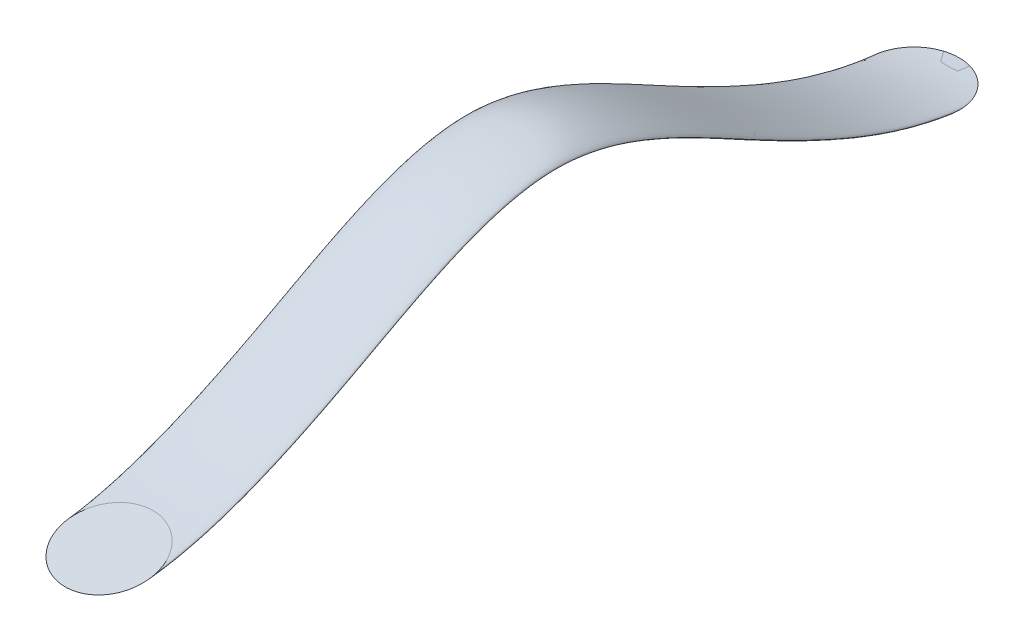
ISO-10303-21;
HEADER;
FILE_DESCRIPTION(('STEP AP214'),'2;1');
FILE_NAME('part.step','',(''),(''),'','','');
FILE_SCHEMA(('AUTOMOTIVE_DESIGN { 1 0 10303 214 1 1 1 1 }'));
ENDSEC;
DATA;
#1=APPLICATION_CONTEXT('core data for automotive mechanical design processes');
#2=APPLICATION_PROTOCOL_DEFINITION('international standard','automotive_design',2000,#1);
#3=PRODUCT_CONTEXT('',#1,'mechanical');
#4=PRODUCT('Part','Part','',(#3));
#5=PRODUCT_RELATED_PRODUCT_CATEGORY('part','',(#4));
#6=PRODUCT_DEFINITION_FORMATION('','',#4);
#7=PRODUCT_DEFINITION_CONTEXT('part definition',#1,'design');
#8=PRODUCT_DEFINITION('design','',#6,#7);
#9=PRODUCT_DEFINITION_SHAPE('','',#8);
#10=(LENGTH_UNIT() NAMED_UNIT(*) SI_UNIT(.MILLI.,.METRE.));
#11=(NAMED_UNIT(*) PLANE_ANGLE_UNIT() SI_UNIT($,.RADIAN.));
#12=(NAMED_UNIT(*) SI_UNIT($,.STERADIAN.) SOLID_ANGLE_UNIT());
#13=UNCERTAINTY_MEASURE_WITH_UNIT(LENGTH_MEASURE(1.E-05),#10,'distance_accuracy_value','');
#14=(GEOMETRIC_REPRESENTATION_CONTEXT(3) GLOBAL_UNCERTAINTY_ASSIGNED_CONTEXT((#13)) GLOBAL_UNIT_ASSIGNED_CONTEXT((#10,
#11,#12)) REPRESENTATION_CONTEXT('',''));
#15=CARTESIAN_POINT('',(0.,0.,0.));
#16=DIRECTION('',(0.,0.,1.));
#17=DIRECTION('',(1.,0.,0.));
#18=AXIS2_PLACEMENT_3D('',#15,#16,#17);
#19=CARTESIAN_POINT('',(0.002851618227563,0.,320.));
#20=DIRECTION('',(0.,-0.969230769230747,-0.246153846153936));
#21=DIRECTION('',(0.,0.246153846153936,-0.969230769230747));
#22=AXIS2_PLACEMENT_3D('',#19,#20,#21);
#23=PLANE('',#22);
#24=CARTESIAN_POINT('',(18.,0.,320.));
#25=CARTESIAN_POINT('',(18.,-7.361913934838,348.98753611842));
#26=CARTESIAN_POINT('',(-18.98186742986,-8.418959482688,353.14965296308));
#27=CARTESIAN_POINT('',(-49.48410457815,0.,320.));
#28=CARTESIAN_POINT('',(-18.98186742986,8.418959482688,286.85034703691));
#29=CARTESIAN_POINT('',(18.,7.361913934838,291.01246388157));
#30=CARTESIAN_POINT('',(18.,0.,320.));
#31=(BOUNDED_CURVE() B_SPLINE_CURVE(6,(#24,#25,#26,#27,#28,#29,#30),.UNSPECIFIED.,.T.,
.F.) B_SPLINE_CURVE_WITH_KNOTS((7,7),(0.,6.28318530718),
.UNSPECIFIED.) CURVE() GEOMETRIC_REPRESENTATION_ITEM() RATIONAL_B_SPLINE_CURVE((1.669078461068,
1.03672962321,1.038346699848,0.853534330196,1.038346699848,1.03672962321,1.669078461068)) REPRESENTATION_ITEM(''));
#32=CARTESIAN_POINT('',(18.,0.,320.));
#33=VERTEX_POINT('',#32);
#34=EDGE_CURVE('E10',#33,#33,#31,.T.);
#35=ORIENTED_EDGE('',*,*,#34,.F.);
#36=EDGE_LOOP('',(#35));
#37=FACE_BOUND('',#36,.T.);
#38=ADVANCED_FACE('F16',(#37),#23,.F.);
#39=CARTESIAN_POINT('',(0.002851618227622,0.,0.));
#40=DIRECTION('',(0.,-1.,0.));
#41=DIRECTION('',(0.,0.,-1.));
#42=AXIS2_PLACEMENT_3D('',#39,#40,#41);
#43=PLANE('',#42);
#44=CARTESIAN_POINT('',(18.,0.,0.));
#45=CARTESIAN_POINT('',(18.,0.,29.907775360279));
#46=CARTESIAN_POINT('',(-18.98186742986,0.,34.202022898421));
#47=CARTESIAN_POINT('',(-49.48410457815,0.,0.));
#48=CARTESIAN_POINT('',(-18.98186742986,0.,-34.20202289842));
#49=CARTESIAN_POINT('',(18.,0.,-29.90777536027));
#50=CARTESIAN_POINT('',(18.,0.,0.));
#51=(BOUNDED_CURVE() B_SPLINE_CURVE(6,(#44,#45,#46,#47,#48,#49,#50),.UNSPECIFIED.,.T.,
.F.) B_SPLINE_CURVE_WITH_KNOTS((7,7),(0.,6.28318530718),
.UNSPECIFIED.) CURVE() GEOMETRIC_REPRESENTATION_ITEM() RATIONAL_B_SPLINE_CURVE((1.669078461068,
1.03672962321,1.038346699848,0.853534330196,1.038346699848,1.03672962321,1.669078461068)) REPRESENTATION_ITEM(''));
#52=CARTESIAN_POINT('',(18.,0.,0.));
#53=VERTEX_POINT('',#52);
#54=EDGE_CURVE('E42',#53,#53,#51,.T.);
#55=ORIENTED_EDGE('',*,*,#54,.T.);
#56=EDGE_LOOP('',(#55));
#57=FACE_BOUND('',#56,.T.);
#58=ADVANCED_FACE('F45',(#57),#43,.T.);
#59=CARTESIAN_POINT('',(18.,0.,0.));
#60=CARTESIAN_POINT('',(18.,1.,7.999999999997));
#61=CARTESIAN_POINT('',(17.999999999999,2.611111111111,16.000000000014));
#62=CARTESIAN_POINT('',(18.000000000001,4.770833333332,23.999999999966));
#63=CARTESIAN_POINT('',(17.999999999998,7.41666666667,32.000000000059));
#64=CARTESIAN_POINT('',(18.000000000003,10.486111111105,39.99999999993));
#65=CARTESIAN_POINT('',(17.999999999997,13.916666666673,48.000000000061));
#66=CARTESIAN_POINT('',(18.000000000002,17.645833333329,55.999999999962));
#67=CARTESIAN_POINT('',(17.999999999999,21.611111111113,64.0000000000159));
#68=CARTESIAN_POINT('',(18.,25.75,71.999999999997));
#69=CARTESIAN_POINT('',(18.,34.25,88.000000000002));
#70=CARTESIAN_POINT('',(17.999999999999,38.611111111109,95.9999999999979));
#71=CARTESIAN_POINT('',(18.000000000003,42.937500000004,104.));
#72=CARTESIAN_POINT('',(17.999999999995,47.083333333328,111.99999999999));
#73=CARTESIAN_POINT('',(18.000000000005,50.902777777784,120.));
#74=CARTESIAN_POINT('',(17.999999999996,54.249999999995,127.99999999999));
#75=CARTESIAN_POINT('',(18.000000000002,56.979166666669,136.));
#76=CARTESIAN_POINT('',(18.,58.944444444444,143.99999999999));
#77=CARTESIAN_POINT('',(18.,60.,152.));
#78=CARTESIAN_POINT('',(18.,60.,167.99999999999));
#79=CARTESIAN_POINT('',(17.999999999999,58.944444444442,176.));
#80=CARTESIAN_POINT('',(18.000000000003,56.979166666672,183.99999999999));
#81=CARTESIAN_POINT('',(17.999999999994,54.249999999992,192.));
#82=CARTESIAN_POINT('',(18.000000000007,50.902777777785,199.99999999999));
#83=CARTESIAN_POINT('',(17.999999999994,47.083333333329,208.));
#84=CARTESIAN_POINT('',(18.000000000003,42.937500000002,215.99999999999));
#85=CARTESIAN_POINT('',(17.999999999999,38.61111111111,224.));
#86=CARTESIAN_POINT('',(18.,34.25,231.99999999999));
#87=CARTESIAN_POINT('',(18.,25.75,248.));
#88=CARTESIAN_POINT('',(17.999999999999,21.611111111113,255.99999999999));
#89=CARTESIAN_POINT('',(18.000000000003,17.645833333331,264.00000000001));
#90=CARTESIAN_POINT('',(17.999999999995,13.91666666667,271.99999999997));
#91=CARTESIAN_POINT('',(18.000000000006,10.486111111108,280.00000000002));
#92=CARTESIAN_POINT('',(17.999999999995,7.41666666666899,287.99999999998));
#93=CARTESIAN_POINT('',(18.000000000003,4.770833333332,296.00000000001));
#94=CARTESIAN_POINT('',(17.999999999998,2.611111111112,303.99999999999));
#95=CARTESIAN_POINT('',(18.,1.,312.));
#96=CARTESIAN_POINT('',(18.,0.,320.));
#97=CARTESIAN_POINT('',(18.,0.,29.907775360279));
#98=CARTESIAN_POINT('',(18.,3.024526332081,37.90777536028));
#99=CARTESIAN_POINT('',(17.999999999999,6.438047910399,45.755503294274));
#100=CARTESIAN_POINT('',(18.000000000001,10.152053909414,53.5073571757081));
#101=CARTESIAN_POINT('',(17.999999999999,14.109930858211,61.218031004849));
#102=CARTESIAN_POINT('',(18.000000000001,18.271009251131,68.9247641940741));
#103=CARTESIAN_POINT('',(17.999999999999,22.597387757939,76.64978772286));
#104=CARTESIAN_POINT('',(18.,27.046976310694,84.407085050043));
#105=CARTESIAN_POINT('',(18.,31.572729087688,92.206178395924));
#106=CARTESIAN_POINT('',(18.,36.124568157119,100.05224358835));
#107=CARTESIAN_POINT('',(18.,45.169488416741,115.84465491802));
#108=CARTESIAN_POINT('',(18.,49.480929520386,123.86019727869));
#109=CARTESIAN_POINT('',(18.,53.452628086978,132.0026944003));
#110=CARTESIAN_POINT('',(18.,56.927628678932,140.26340634723));
#111=CARTESIAN_POINT('',(17.999999999999,59.737290538436,148.64600520067));
#112=CARTESIAN_POINT('',(18.000000000001,61.649720994024,157.09693076155));
#113=CARTESIAN_POINT('',(17.999999999999,62.486851956086,165.60688757064));
#114=CARTESIAN_POINT('',(18.,61.908423664922,174.03876773349));
#115=CARTESIAN_POINT('',(18.,59.814519851051,182.11733918548));
#116=CARTESIAN_POINT('',(18.,52.766274191017,197.23630847797));
#117=CARTESIAN_POINT('',(17.999999999998,48.677506373275,204.38490307204));
#118=CARTESIAN_POINT('',(18.000000000004,44.353099368763,211.34016849721));
#119=CARTESIAN_POINT('',(17.999999999993,39.915641310642,218.38017080115));
#120=CARTESIAN_POINT('',(18.000000000008,35.288771821893,225.58994036109));
#121=CARTESIAN_POINT('',(17.999999999993,30.584793205205,232.97055191303));
#122=CARTESIAN_POINT('',(18.000000000004,25.852943386392,240.55273381272));
#123=CARTESIAN_POINT('',(17.999999999998,21.217853938134,248.32731283091));
#124=CARTESIAN_POINT('',(18.,16.812426939338,256.30002223335));
#125=CARTESIAN_POINT('',(18.,8.789481672119,272.63535777773));
#126=CARTESIAN_POINT('',(18.000000000001,5.012945159436,280.88620540488));
#127=CARTESIAN_POINT('',(17.999999999998,1.541443050643,289.21889339254));
#128=CARTESIAN_POINT('',(18.000000000003,-1.549210753571,297.63146290892));
#129=CARTESIAN_POINT('',(17.999999999996,-4.179193656993,306.11848883054));
#130=CARTESIAN_POINT('',(18.000000000003,-6.262781643254,314.67144194218));
#131=CARTESIAN_POINT('',(17.999999999998,-7.708160683656,323.27483035155));
#132=CARTESIAN_POINT('',(18.,-8.422505366791,331.89793413463));
#133=CARTESIAN_POINT('',(18.,-8.324147149008,340.48919117514));
#134=CARTESIAN_POINT('',(18.,-7.361913934838,348.98753611842));
#135=CARTESIAN_POINT('',(-18.98186742986,0.,34.202022898421));
#136=CARTESIAN_POINT('',(-18.98186742986,3.31521385774,42.202022898422));
#137=CARTESIAN_POINT('',(-18.98186742986,6.987530903735,50.027887155271));
#138=CARTESIAN_POINT('',(-18.98186742986,10.924705600576,57.744111477308));
#139=CARTESIAN_POINT('',(-18.98186742986,15.070969682747,65.413242992376));
#140=CARTESIAN_POINT('',(-18.98186742986,19.388788132032,73.077868058731));
#141=CARTESIAN_POINT('',(-18.98186742986,23.843791568536,80.763409646081));
#142=CARTESIAN_POINT('',(-18.98186742986,28.396820443195,88.485859000051));
#143=CARTESIAN_POINT('',(-18.98186742986,33.003047891294,96.256105569639));
#144=CARTESIAN_POINT('',(-18.98186742986,37.614179578608,104.08006834354));
#145=CARTESIAN_POINT('',(-18.98186742986,46.737341113456,119.84267347312));
#146=CARTESIAN_POINT('',(-18.98186742986,51.041650449367,127.86044745227));
#147=CARTESIAN_POINT('',(-18.98186742986,54.962421522194,136.02340473536));
#148=CARTESIAN_POINT('',(-18.98186742986,58.3411019494489,144.32155048079));
#149=CARTESIAN_POINT('',(-18.98186742986,61.005776215368,152.75908401809));
#150=CARTESIAN_POINT('',(-18.98186742986,62.712194992123,161.27475481517));
#151=CARTESIAN_POINT('',(-18.98186742986,63.277661827773,169.85793274303));
#152=CARTESIAN_POINT('',(-18.98186742986,62.3340006367049,178.35182354705));
#153=CARTESIAN_POINT('',(-18.98186742986,59.787888058369,186.44167652233));
#154=CARTESIAN_POINT('',(-18.98186742986,51.727634276392,201.43414479958));
#155=CARTESIAN_POINT('',(-18.98186742986,47.20334880036,208.46049206751));
#156=CARTESIAN_POINT('',(-18.98186742986,42.54021098916,215.2657513882));
#157=CARTESIAN_POINT('',(-18.98186742986,37.857471360818,222.16791436125));
#158=CARTESIAN_POINT('',(-18.98186742987,33.046866303047,229.26422027906));
#159=CARTESIAN_POINT('',(-18.98186742986,28.215883633209,236.55589819125));
#160=CARTESIAN_POINT('',(-18.98186742986,23.399891820554,244.07808852266));
#161=CARTESIAN_POINT('',(-18.98186742986,18.720478225781,251.82030092432));
#162=CARTESIAN_POINT('',(-18.98186742986,14.308688219728,259.78909186141));
#163=CARTESIAN_POINT('',(-18.98186742986,6.354239893092,276.17257588285));
#164=CARTESIAN_POINT('',(-18.98186742986,2.629731014718,284.45944096006));
#165=CARTESIAN_POINT('',(-18.98186742986,-0.770873311627,292.83989728071));
#166=CARTESIAN_POINT('',(-18.98186742987,-3.769847535713,301.31170475803));
#167=CARTESIAN_POINT('',(-18.98186742986,-6.284881831318,309.86865931333));
#168=CARTESIAN_POINT('',(-18.98186742987,-8.226917608581,318.50100708094));
#169=CARTESIAN_POINT('',(-18.98186742986,-9.499931843175,327.19103179684));
#170=CARTESIAN_POINT('',(-18.98186742986,-10.00674491073,335.90360267846));
#171=CARTESIAN_POINT('',(-18.98186742986,-9.662935990959,344.57975416733));
#172=CARTESIAN_POINT('',(-18.98186742986,-8.418959482688,353.14965296308));
#173=CARTESIAN_POINT('',(-49.48410457815,0.,0.));
#174=CARTESIAN_POINT('',(-49.48410457815,1.000000000001,8.000000000002));
#175=CARTESIAN_POINT('',(-49.48410457815,2.611111111109,15.999999999994));
#176=CARTESIAN_POINT('',(-49.48410457814,4.770833333337,24.000000000011));
#177=CARTESIAN_POINT('',(-49.48410457816,7.416666666663,31.999999999989));
#178=CARTESIAN_POINT('',(-49.48410457813,10.486111111113,40.000000000007));
#179=CARTESIAN_POINT('',(-49.48410457817,13.916666666667,47.999999999999));
#180=CARTESIAN_POINT('',(-49.48410457814,17.645833333332,55.999999999998));
#181=CARTESIAN_POINT('',(-49.48410457815,21.611111111112,64.000000000002));
#182=CARTESIAN_POINT('',(-49.48410457815,25.75,71.9999999999991));
#183=CARTESIAN_POINT('',(-49.48410457815,34.25,88.0000000000009));
#184=CARTESIAN_POINT('',(-49.48410457815,38.61111111111,95.9999999999971));
#185=CARTESIAN_POINT('',(-49.48410457815,42.937500000002,104.));
#186=CARTESIAN_POINT('',(-49.48410457814,47.083333333331,111.99999999999));
#187=CARTESIAN_POINT('',(-49.48410457816,50.902777777779,120.));
#188=CARTESIAN_POINT('',(-49.48410457814,54.25,127.99999999999));
#189=CARTESIAN_POINT('',(-49.48410457815,56.979166666666,136.));
#190=CARTESIAN_POINT('',(-49.48410457815,58.944444444445,143.99999999999));
#191=CARTESIAN_POINT('',(-49.48410457815,60.,152.));
#192=CARTESIAN_POINT('',(-49.48410457815,60.,168.));
#193=CARTESIAN_POINT('',(-49.48410457815,58.944444444445,175.99999999999));
#194=CARTESIAN_POINT('',(-49.48410457815,56.979166666665,184.));
#195=CARTESIAN_POINT('',(-49.48410457814,54.250000000004,191.99999999998));
#196=CARTESIAN_POINT('',(-49.48410457816,50.902777777772,200.00000000001));
#197=CARTESIAN_POINT('',(-49.48410457814,47.08333333334,207.99999999998));
#198=CARTESIAN_POINT('',(-49.48410457815,42.937499999995,216.00000000001));
#199=CARTESIAN_POINT('',(-49.48410457815,38.611111111113,223.99999999999));
#200=CARTESIAN_POINT('',(-49.48410457815,34.25,232.));
#201=CARTESIAN_POINT('',(-49.48410457815,25.75,248.));
#202=CARTESIAN_POINT('',(-49.48410457815,21.611111111111,255.99999999999));
#203=CARTESIAN_POINT('',(-49.48410457815,17.645833333335,264.00000000001));
#204=CARTESIAN_POINT('',(-49.48410457815,13.916666666663,271.99999999998));
#205=CARTESIAN_POINT('',(-49.48410457815,10.486111111116,280.00000000001));
#206=CARTESIAN_POINT('',(-49.48410457815,7.416666666661,287.99999999999));
#207=CARTESIAN_POINT('',(-49.48410457815,4.770833333337,296.));
#208=CARTESIAN_POINT('',(-49.48410457815,2.611111111109,304.));
#209=CARTESIAN_POINT('',(-49.48410457815,1.,312.));
#210=CARTESIAN_POINT('',(-49.48410457815,0.,320.));
#211=CARTESIAN_POINT('',(-18.98186742986,0.,-34.20202289842));
#212=CARTESIAN_POINT('',(-18.98186742986,-1.315213857739,-26.20202289842));
#213=CARTESIAN_POINT('',(-18.98186742986,-1.765308681513,-18.02788715527));
#214=CARTESIAN_POINT('',(-18.98186742986,-1.38303893391,-9.74411147730499));
#215=CARTESIAN_POINT('',(-18.98186742986,-0.237636349409,-1.413242992374));
#216=CARTESIAN_POINT('',(-18.98186742987,1.583434090181,6.922131941262));
#217=CARTESIAN_POINT('',(-18.98186742986,3.989541764808,15.236590353927));
#218=CARTESIAN_POINT('',(-18.98186742986,6.894846223463,23.514140999943));
#219=CARTESIAN_POINT('',(-18.98186742986,10.219174330933,31.743894430364));
#220=CARTESIAN_POINT('',(-18.98186742986,13.885820421391,39.919931656457));
#221=CARTESIAN_POINT('',(-18.98186742986,21.762658886545,56.157326526875));
#222=CARTESIAN_POINT('',(-18.98186742986,26.180571772853,64.139552547727));
#223=CARTESIAN_POINT('',(-18.98186742986,30.912578477811,71.976595264634));
#224=CARTESIAN_POINT('',(-18.98186742986,35.825564717212,79.67844951921));
#225=CARTESIAN_POINT('',(-18.98186742986,40.799779340193,87.240915981893));
#226=CARTESIAN_POINT('',(-18.98186742986,45.787805007874,94.725245184837));
#227=CARTESIAN_POINT('',(-18.98186742986,50.680671505562,102.14206725696));
#228=CARTESIAN_POINT('',(-18.98186742986,55.554888252183,109.64817645294));
#229=CARTESIAN_POINT('',(-18.98186742986,60.212111941631,117.55832347766));
#230=CARTESIAN_POINT('',(-18.98186742986,68.2723657236089,134.56585520041));
#231=CARTESIAN_POINT('',(-18.98186742986,70.685540088525,143.53950793248));
#232=CARTESIAN_POINT('',(-18.98186742986,71.418122344182,152.73424861179));
#233=CARTESIAN_POINT('',(-18.98186742986,70.642528639171,161.83208563873));
#234=CARTESIAN_POINT('',(-18.98186742987,68.7586892525181,170.73577972095));
#235=CARTESIAN_POINT('',(-18.98186742986,65.950783033453,179.44410180872));
#236=CARTESIAN_POINT('',(-18.98186742986,62.475108179447,187.92191147735));
#237=CARTESIAN_POINT('',(-18.98186742986,58.501743996442,196.17969907566));
#238=CARTESIAN_POINT('',(-18.98186742986,54.191311780272,204.21090813859));
#239=CARTESIAN_POINT('',(-18.98186742986,45.145760106908,219.82742411714));
#240=CARTESIAN_POINT('',(-18.98186742986,40.592491207504,227.54055903993));
#241=CARTESIAN_POINT('',(-18.98186742986,36.062539978294,235.1601027193));
#242=CARTESIAN_POINT('',(-18.98186742987,31.603180869044,242.68829524195));
#243=CARTESIAN_POINT('',(-18.98186742985,27.257104053545,250.13134068668));
#244=CARTESIAN_POINT('',(-18.98186742987,23.060250941909,257.49899291904));
#245=CARTESIAN_POINT('',(-18.98186742986,19.041598509845,264.80896820316));
#246=CARTESIAN_POINT('',(-18.98186742986,15.228967132952,272.09639732153));
#247=CARTESIAN_POINT('',(-18.98186742986,11.662935990959,279.42024583266));
#248=CARTESIAN_POINT('',(-18.98186742986,8.418959482688,286.85034703691));
#249=CARTESIAN_POINT('',(18.,0.,-29.90777536027));
#250=CARTESIAN_POINT('',(18.,-1.02452633208,-21.90777536027));
#251=CARTESIAN_POINT('',(18.000000000001,-1.215825688179,-13.75550329428));
#252=CARTESIAN_POINT('',(17.999999999999,-0.610387242745,-5.507357175698));
#253=CARTESIAN_POINT('',(18.000000000002,0.723402475122,2.781968995146));
#254=CARTESIAN_POINT('',(17.999999999997,2.701212971087,11.075235805922));
#255=CARTESIAN_POINT('',(18.000000000002,5.235945575401,19.35021227715));
#256=CARTESIAN_POINT('',(17.999999999999,8.244690355967,27.592914949947));
#257=CARTESIAN_POINT('',(18.000000000001,11.649493134538,35.793821604081));
#258=CARTESIAN_POINT('',(18.,15.37543184288,43.947756411642));
#259=CARTESIAN_POINT('',(18.,23.33051158326,60.155345081975));
#260=CARTESIAN_POINT('',(18.,27.741292701835,68.139802721298));
#261=CARTESIAN_POINT('',(18.,32.422371913023,75.997305599708));
#262=CARTESIAN_POINT('',(17.999999999999,37.239037987736,83.736593652751));
#263=CARTESIAN_POINT('',(18.000000000001,42.068265017115,91.353994799338));
#264=CARTESIAN_POINT('',(17.999999999999,46.850279005981,98.9030692384329));
#265=CARTESIAN_POINT('',(18.,51.471481377244,106.39311242936));
#266=CARTESIAN_POINT('',(18.,55.980465223968,113.9612322665));
#267=CARTESIAN_POINT('',(18.,60.185480148948,121.88266081452));
#268=CARTESIAN_POINT('',(18.,67.233725808984,138.76369152202));
#269=CARTESIAN_POINT('',(18.,69.211382515612,147.61509692796));
#270=CARTESIAN_POINT('',(18.,69.605233964575,156.65983150277));
#271=CARTESIAN_POINT('',(17.999999999999,68.584358689353,165.61982919886));
#272=CARTESIAN_POINT('',(18.000000000001,66.516783733666,174.4100596389));
#273=CARTESIAN_POINT('',(17.999999999999,63.581873461461,183.02944808697));
#274=CARTESIAN_POINT('',(18.,60.022056613607,191.44726618728));
#275=CARTESIAN_POINT('',(18.,56.004368284088,199.67268716908));
#276=CARTESIAN_POINT('',(18.,51.687573060662,207.69997776665));
#277=CARTESIAN_POINT('',(18.,42.710518327881,223.36464222226));
#278=CARTESIAN_POINT('',(18.000000000001,38.209277062786,231.11379459511));
#279=CARTESIAN_POINT('',(17.999999999998,33.750223616024,238.78110660744));
#280=CARTESIAN_POINT('',(18.000000000004,29.3825440869,246.36853709111));
#281=CARTESIAN_POINT('',(17.999999999995,25.151415879223,253.8815111694));
#282=CARTESIAN_POINT('',(18.000000000005,21.09611497658,261.32855805786));
#283=CARTESIAN_POINT('',(17.999999999997,17.249827350328,268.7251696484));
#284=CARTESIAN_POINT('',(18.000000000001,13.644727589011,276.10206586538));
#285=CARTESIAN_POINT('',(18.,10.324147149009,283.51080882485));
#286=CARTESIAN_POINT('',(18.,7.361913934838,291.01246388157));
#287=CARTESIAN_POINT('',(18.,0.,0.));
#288=CARTESIAN_POINT('',(18.,1.,7.999999999997));
#289=CARTESIAN_POINT('',(17.999999999999,2.611111111111,16.000000000014));
#290=CARTESIAN_POINT('',(18.000000000001,4.770833333332,23.999999999966));
#291=CARTESIAN_POINT('',(17.999999999998,7.41666666667,32.000000000059));
#292=CARTESIAN_POINT('',(18.000000000003,10.486111111105,39.99999999993));
#293=CARTESIAN_POINT('',(17.999999999997,13.916666666673,48.000000000061));
#294=CARTESIAN_POINT('',(18.000000000002,17.645833333329,55.999999999962));
#295=CARTESIAN_POINT('',(17.999999999999,21.611111111113,64.0000000000159));
#296=CARTESIAN_POINT('',(18.,25.75,71.999999999997));
#297=CARTESIAN_POINT('',(18.,34.25,88.000000000002));
#298=CARTESIAN_POINT('',(17.999999999999,38.611111111109,95.9999999999979));
#299=CARTESIAN_POINT('',(18.000000000003,42.937500000004,104.));
#300=CARTESIAN_POINT('',(17.999999999995,47.083333333328,111.99999999999));
#301=CARTESIAN_POINT('',(18.000000000005,50.902777777784,120.));
#302=CARTESIAN_POINT('',(17.999999999996,54.249999999995,127.99999999999));
#303=CARTESIAN_POINT('',(18.000000000002,56.979166666669,136.));
#304=CARTESIAN_POINT('',(18.,58.944444444444,143.99999999999));
#305=CARTESIAN_POINT('',(18.,60.,152.));
#306=CARTESIAN_POINT('',(18.,60.,167.99999999999));
#307=CARTESIAN_POINT('',(17.999999999999,58.944444444442,176.));
#308=CARTESIAN_POINT('',(18.000000000003,56.979166666672,183.99999999999));
#309=CARTESIAN_POINT('',(17.999999999994,54.249999999992,192.));
#310=CARTESIAN_POINT('',(18.000000000007,50.902777777785,199.99999999999));
#311=CARTESIAN_POINT('',(17.999999999994,47.083333333329,208.));
#312=CARTESIAN_POINT('',(18.000000000003,42.937500000002,215.99999999999));
#313=CARTESIAN_POINT('',(17.999999999999,38.61111111111,224.));
#314=CARTESIAN_POINT('',(18.,34.25,231.99999999999));
#315=CARTESIAN_POINT('',(18.,25.75,248.));
#316=CARTESIAN_POINT('',(17.999999999999,21.611111111113,255.99999999999));
#317=CARTESIAN_POINT('',(18.000000000003,17.645833333331,264.00000000001));
#318=CARTESIAN_POINT('',(17.999999999995,13.91666666667,271.99999999997));
#319=CARTESIAN_POINT('',(18.000000000006,10.486111111108,280.00000000002));
#320=CARTESIAN_POINT('',(17.999999999995,7.41666666666899,287.99999999998));
#321=CARTESIAN_POINT('',(18.000000000003,4.770833333332,296.00000000001));
#322=CARTESIAN_POINT('',(17.999999999998,2.611111111112,303.99999999999));
#323=CARTESIAN_POINT('',(18.,1.,312.));
#324=CARTESIAN_POINT('',(18.,0.,320.));
#325=(BOUNDED_SURFACE() B_SPLINE_SURFACE(6,10,((#59,#60,#61,#62,#63,#64,#65,#66,#67,#68,#69,#70,
#71,#72,#73,#74,#75,#76,#77,#78,#79,#80,#81,#82,#83,#84,#85,#86,#87,#88,#89,#90,#91,#92,#93,#94,
#95,#96),(#97,#98,#99,#100,#101,#102,#103,#104,#105,#106,#107,#108,#109,#110,#111,#112,#113,
#114,#115,#116,#117,#118,#119,#120,#121,#122,#123,#124,#125,#126,#127,#128,#129,#130,#131,#132,
#133,#134),(#135,#136,#137,#138,#139,#140,#141,#142,#143,#144,#145,#146,#147,#148,#149,#150,
#151,#152,#153,#154,#155,#156,#157,#158,#159,#160,#161,#162,#163,#164,#165,#166,#167,#168,#169,
#170,#171,#172),(#173,#174,#175,#176,#177,#178,#179,#180,#181,#182,#183,#184,#185,#186,#187,
#188,#189,#190,#191,#192,#193,#194,#195,#196,#197,#198,#199,#200,#201,#202,#203,#204,#205,#206,
#207,#208,#209,#210),(#211,#212,#213,#214,#215,#216,#217,#218,#219,#220,#221,#222,#223,#224,
#225,#226,#227,#228,#229,#230,#231,#232,#233,#234,#235,#236,#237,#238,#239,#240,#241,#242,#243,
#244,#245,#246,#247,#248),(#249,#250,#251,#252,#253,#254,#255,#256,#257,#258,#259,#260,#261,
#262,#263,#264,#265,#266,#267,#268,#269,#270,#271,#272,#273,#274,#275,#276,#277,#278,#279,#280,
#281,#282,#283,#284,#285,#286),(#287,#288,#289,#290,#291,#292,#293,#294,#295,#296,#297,#298,
#299,#300,#301,#302,#303,#304,#305,#306,#307,#308,#309,#310,#311,#312,#313,#314,#315,#316,#317,
#318,#319,#320,#321,#322,#323,#324)),.UNSPECIFIED.,.T.,.F.,.F.) B_SPLINE_SURFACE_WITH_KNOTS((7,
7),(11,9,9,9,11),(0.,6.28318530718),(0.,85.440037453175,170.88007490635,256.32011235952,
341.7601498127),
.UNSPECIFIED.) GEOMETRIC_REPRESENTATION_ITEM() RATIONAL_B_SPLINE_SURFACE(((1.669078461068,
1.669078461068,1.669078461068,1.669078461069,1.669078461067,1.669078461069,1.669078461068,
1.669078461069,1.669078461068,1.669078461068,1.669078461068,1.669078461068,1.669078461068,
1.669078461068,1.669078461068,1.669078461068,1.669078461068,1.669078461068,1.669078461068,
1.669078461068,1.669078461068,1.669078461068,1.669078461069,1.669078461067,1.669078461069,
1.669078461068,1.669078461068,1.669078461068,1.669078461068,1.669078461068,1.669078461069,
1.669078461068,1.669078461069,1.669078461068,1.669078461068,1.669078461068,1.669078461068,
1.669078461068),(1.03672962321,1.03672962321,1.036729623209,1.03672962321,1.036729623209,
1.03672962321,1.036729623209,1.03672962321,1.03672962321,1.03672962321,1.03672962321,
1.03672962321,1.03672962321,1.036729623209,1.03672962321,1.036729623209,1.03672962321,
1.03672962321,1.03672962321,1.03672962321,1.03672962321,1.036729623209,1.03672962321,
1.036729623209,1.03672962321,1.036729623209,1.03672962321,1.03672962321,1.03672962321,
1.036729623209,1.03672962321,1.036729623209,1.03672962321,1.036729623209,1.03672962321,
1.03672962321,1.03672962321,1.03672962321),(1.038346699848,1.038346699848,1.038346699847,
1.038346699848,1.038346699847,1.038346699848,1.038346699847,1.038346699848,1.038346699847,
1.038346699848,1.038346699848,1.038346699847,1.038346699848,1.038346699847,1.038346699848,
1.038346699847,1.038346699848,1.038346699847,1.038346699848,1.038346699847,1.038346699848,
1.038346699847,1.038346699848,1.038346699847,1.038346699848,1.038346699847,1.038346699848,
1.038346699847,1.038346699848,1.038346699847,1.038346699848,1.038346699847,1.038346699848,
1.038346699847,1.038346699848,1.038346699847,1.038346699848,1.038346699848),(0.853534330196,
0.853534330196,0.853534330196,0.853534330197,0.853534330196,0.853534330197,0.853534330196,
0.853534330196,0.853534330196,0.853534330196,0.853534330196,0.853534330196,0.853534330196,
0.853534330196,0.853534330196,0.853534330196,0.853534330196,0.853534330196,0.853534330196,
0.853534330196,0.853534330196,0.853534330196,0.853534330197,0.853534330196,0.853534330197,
0.853534330196,0.853534330196,0.853534330196,0.853534330196,0.853534330196,0.853534330196,
0.853534330196,0.853534330196,0.853534330196,0.853534330196,0.853534330196,0.853534330196,
0.853534330196),(1.038346699848,1.038346699848,1.038346699847,1.038346699848,1.038346699847,
1.038346699848,1.038346699847,1.038346699848,1.038346699847,1.038346699848,1.038346699848,
1.038346699847,1.038346699848,1.038346699847,1.038346699848,1.038346699847,1.038346699848,
1.038346699847,1.038346699848,1.038346699847,1.038346699848,1.038346699847,1.038346699848,
1.038346699847,1.038346699848,1.038346699847,1.038346699848,1.038346699847,1.038346699848,
1.038346699847,1.038346699848,1.038346699847,1.038346699848,1.038346699847,1.038346699848,
1.038346699847,1.038346699848,1.038346699848),(1.03672962321,1.03672962321,1.036729623209,
1.03672962321,1.036729623209,1.03672962321,1.036729623209,1.03672962321,1.036729623209,
1.03672962321,1.03672962321,1.03672962321,1.03672962321,1.036729623209,1.03672962321,
1.036729623209,1.03672962321,1.03672962321,1.03672962321,1.03672962321,1.03672962321,
1.036729623209,1.03672962321,1.036729623209,1.03672962321,1.036729623209,1.03672962321,
1.03672962321,1.03672962321,1.036729623209,1.03672962321,1.036729623209,1.03672962321,
1.036729623209,1.03672962321,1.03672962321,1.03672962321,1.03672962321),(1.669078461068,
1.669078461068,1.669078461068,1.669078461069,1.669078461067,1.669078461069,1.669078461068,
1.669078461069,1.669078461068,1.669078461068,1.669078461068,1.669078461068,1.669078461068,
1.669078461068,1.669078461068,1.669078461068,1.669078461068,1.669078461068,1.669078461068,
1.669078461068,1.669078461068,1.669078461068,1.669078461069,1.669078461067,1.669078461069,
1.669078461068,1.669078461068,1.669078461068,1.669078461068,1.669078461068,1.669078461069,
1.669078461068,1.669078461069,1.669078461068,1.669078461068,1.669078461068,1.669078461068,1.669078461068))) REPRESENTATION_ITEM('') SURFACE());
#326=CARTESIAN_POINT('',(18.,0.,0.));
#327=CARTESIAN_POINT('',(18.,1.,7.999999999997));
#328=CARTESIAN_POINT('',(17.999999999999,2.611111111111,16.000000000014));
#329=CARTESIAN_POINT('',(18.000000000001,4.770833333332,23.999999999966));
#330=CARTESIAN_POINT('',(17.999999999998,7.41666666667,32.000000000059));
#331=CARTESIAN_POINT('',(18.000000000003,10.486111111105,39.99999999993));
#332=CARTESIAN_POINT('',(17.999999999997,13.916666666673,48.000000000061));
#333=CARTESIAN_POINT('',(18.000000000002,17.645833333329,55.999999999962));
#334=CARTESIAN_POINT('',(17.999999999999,21.611111111113,64.0000000000159));
#335=CARTESIAN_POINT('',(18.,25.75,71.999999999997));
#336=CARTESIAN_POINT('',(18.,34.25,88.000000000002));
#337=CARTESIAN_POINT('',(17.999999999999,38.611111111109,95.9999999999979));
#338=CARTESIAN_POINT('',(18.000000000003,42.937500000004,104.));
#339=CARTESIAN_POINT('',(17.999999999995,47.083333333328,111.99999999999));
#340=CARTESIAN_POINT('',(18.000000000005,50.902777777784,120.));
#341=CARTESIAN_POINT('',(17.999999999996,54.249999999995,127.99999999999));
#342=CARTESIAN_POINT('',(18.000000000002,56.979166666669,136.));
#343=CARTESIAN_POINT('',(18.,58.944444444444,143.99999999999));
#344=CARTESIAN_POINT('',(18.,60.,152.));
#345=CARTESIAN_POINT('',(18.,60.,167.99999999999));
#346=CARTESIAN_POINT('',(17.999999999999,58.944444444442,176.));
#347=CARTESIAN_POINT('',(18.000000000003,56.979166666672,183.99999999999));
#348=CARTESIAN_POINT('',(17.999999999994,54.249999999992,192.));
#349=CARTESIAN_POINT('',(18.000000000007,50.902777777785,199.99999999999));
#350=CARTESIAN_POINT('',(17.999999999994,47.083333333329,208.));
#351=CARTESIAN_POINT('',(18.000000000003,42.937500000002,215.99999999999));
#352=CARTESIAN_POINT('',(17.999999999999,38.61111111111,224.));
#353=CARTESIAN_POINT('',(18.,34.25,231.99999999999));
#354=CARTESIAN_POINT('',(18.,25.75,248.));
#355=CARTESIAN_POINT('',(17.999999999999,21.611111111113,255.99999999999));
#356=CARTESIAN_POINT('',(18.000000000003,17.645833333331,264.00000000001));
#357=CARTESIAN_POINT('',(17.999999999995,13.91666666667,271.99999999997));
#358=CARTESIAN_POINT('',(18.000000000006,10.486111111108,280.00000000002));
#359=CARTESIAN_POINT('',(17.999999999995,7.41666666666899,287.99999999998));
#360=CARTESIAN_POINT('',(18.000000000003,4.770833333332,296.00000000001));
#361=CARTESIAN_POINT('',(17.999999999998,2.611111111112,303.99999999999));
#362=CARTESIAN_POINT('',(18.,1.,312.));
#363=CARTESIAN_POINT('',(18.,0.,320.));
#364=(BOUNDED_CURVE() B_SPLINE_CURVE(10,(#326,#327,#328,#329,#330,#331,#332,#333,#334,#335,#336,
#337,#338,#339,#340,#341,#342,#343,#344,#345,#346,#347,#348,#349,#350,#351,#352,#353,#354,#355,
#356,#357,#358,#359,#360,#361,#362,#363),.UNSPECIFIED.,.F.,.F.) B_SPLINE_CURVE_WITH_KNOTS((11,9,
9,9,11),(0.,85.440037453175,170.88007490635,256.32011235952,341.7601498127),
.UNSPECIFIED.) CURVE() GEOMETRIC_REPRESENTATION_ITEM() RATIONAL_B_SPLINE_CURVE((1.669078461068,
1.669078461068,1.669078461068,1.669078461069,1.669078461067,1.669078461069,1.669078461068,
1.669078461069,1.669078461068,1.669078461068,1.669078461068,1.669078461068,1.669078461068,
1.669078461068,1.669078461068,1.669078461068,1.669078461068,1.669078461068,1.669078461068,
1.669078461068,1.669078461068,1.669078461068,1.669078461069,1.669078461067,1.669078461069,
1.669078461068,1.669078461068,1.669078461068,1.669078461068,1.669078461068,1.669078461069,
1.669078461068,1.669078461069,1.669078461068,1.669078461068,1.669078461068,1.669078461068,1.669078461068)) REPRESENTATION_ITEM(''));
#365=EDGE_CURVE('E26',#53,#33,#364,.T.);
#366=ORIENTED_EDGE('',*,*,#54,.F.);
#367=ORIENTED_EDGE('',*,*,#365,.T.);
#368=ORIENTED_EDGE('',*,*,#34,.T.);
#369=ORIENTED_EDGE('',*,*,#365,.F.);
#370=EDGE_LOOP('',(#366,#367,#368,#369));
#371=FACE_BOUND('',#370,.T.);
#372=ADVANCED_FACE('F41',(#371),#325,.F.);
#373=CLOSED_SHELL('',(#38,#58,#372));
#374=MANIFOLD_SOLID_BREP('B1',#373);
#375=ADVANCED_BREP_SHAPE_REPRESENTATION('',(#18,#374),#14);
#376=SHAPE_DEFINITION_REPRESENTATION(#9,#375);
ENDSEC;
END-ISO-10303-21;
